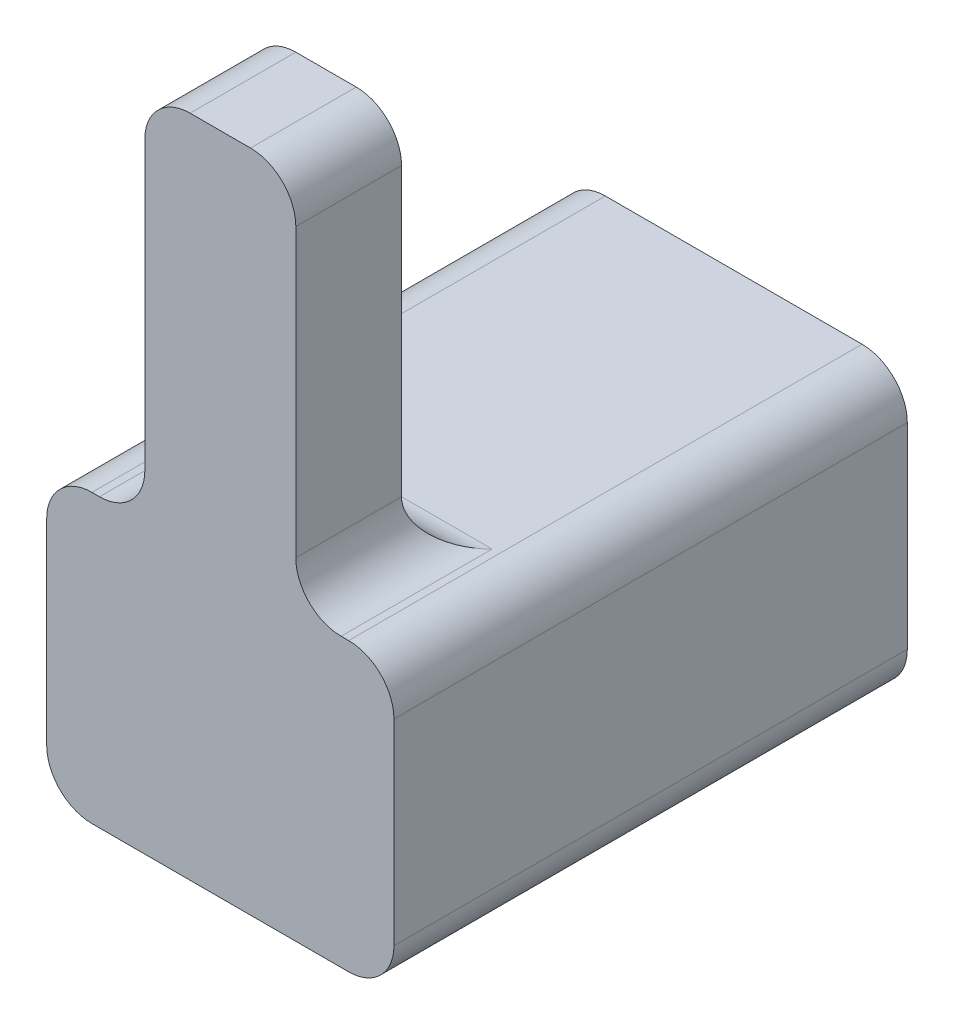
ISO-10303-21;
HEADER;
FILE_DESCRIPTION(('STEP AP214'),'2;1');
FILE_NAME('part.step','',(''),(''),'','','');
FILE_SCHEMA(('AUTOMOTIVE_DESIGN { 1 0 10303 214 1 1 1 1 }'));
ENDSEC;
DATA;
#1=APPLICATION_CONTEXT('core data for automotive mechanical design processes');
#2=APPLICATION_PROTOCOL_DEFINITION('international standard','automotive_design',2000,#1);
#3=PRODUCT_CONTEXT('',#1,'mechanical');
#4=PRODUCT('Part','Part','',(#3));
#5=PRODUCT_RELATED_PRODUCT_CATEGORY('part','',(#4));
#6=PRODUCT_DEFINITION_FORMATION('','',#4);
#7=PRODUCT_DEFINITION_CONTEXT('part definition',#1,'design');
#8=PRODUCT_DEFINITION('design','',#6,#7);
#9=PRODUCT_DEFINITION_SHAPE('','',#8);
#10=(LENGTH_UNIT() NAMED_UNIT(*) SI_UNIT(.MILLI.,.METRE.));
#11=(NAMED_UNIT(*) PLANE_ANGLE_UNIT() SI_UNIT($,.RADIAN.));
#12=(NAMED_UNIT(*) SI_UNIT($,.STERADIAN.) SOLID_ANGLE_UNIT());
#13=UNCERTAINTY_MEASURE_WITH_UNIT(LENGTH_MEASURE(1.E-05),#10,'distance_accuracy_value','');
#14=(GEOMETRIC_REPRESENTATION_CONTEXT(3) GLOBAL_UNCERTAINTY_ASSIGNED_CONTEXT((#13)) GLOBAL_UNIT_ASSIGNED_CONTEXT((#10,
#11,#12)) REPRESENTATION_CONTEXT('',''));
#15=CARTESIAN_POINT('',(0.,0.,0.));
#16=DIRECTION('',(0.,0.,1.));
#17=DIRECTION('',(1.,0.,0.));
#18=AXIS2_PLACEMENT_3D('',#15,#16,#17);
#19=CARTESIAN_POINT('',(-11.5,9.5,34.));
#20=DIRECTION('',(0.,-1.,0.));
#21=DIRECTION('',(0.,0.,-1.));
#22=AXIS2_PLACEMENT_3D('',#19,#20,#21);
#23=PLANE('',#22);
#24=DIRECTION('',(-1.,0.,0.));
#25=VECTOR('',#24,1.);
#26=CARTESIAN_POINT('',(-11.5,9.5,0.));
#27=LINE('',#26,#25);
#28=CARTESIAN_POINT('',(8.5,9.5,0.));
#29=VERTEX_POINT('',#28);
#30=CARTESIAN_POINT('',(-8.5,9.5,0.));
#31=VERTEX_POINT('',#30);
#32=EDGE_CURVE('E363',#29,#31,#27,.T.);
#33=ORIENTED_EDGE('',*,*,#32,.T.);
#34=DIRECTION('',(0.,0.,-1.));
#35=VECTOR('',#34,1.);
#36=CARTESIAN_POINT('',(-8.5,9.5,34.));
#37=LINE('',#36,#35);
#38=CARTESIAN_POINT('',(-8.5,9.5,34.));
#39=VERTEX_POINT('',#38);
#40=EDGE_CURVE('E285',#31,#39,#37,.F.);
#41=ORIENTED_EDGE('',*,*,#40,.T.);
#42=DIRECTION('',(-1.,0.,0.));
#43=VECTOR('',#42,1.);
#44=CARTESIAN_POINT('',(-11.5,9.5,34.));
#45=LINE('',#44,#43);
#46=CARTESIAN_POINT('',(-8.,9.5,34.));
#47=VERTEX_POINT('',#46);
#48=EDGE_CURVE('E353',#47,#39,#45,.T.);
#49=ORIENTED_EDGE('',*,*,#48,.F.);
#50=DIRECTION('',(0.,0.,1.));
#51=VECTOR('',#50,1.);
#52=CARTESIAN_POINT('',(-8.,9.5,27.000000000001));
#53=LINE('',#52,#51);
#54=CARTESIAN_POINT('',(-8.,9.5,24.000000000001));
#55=VERTEX_POINT('',#54);
#56=EDGE_CURVE('E283',#47,#55,#53,.F.);
#57=ORIENTED_EDGE('',*,*,#56,.T.);
#58=DIRECTION('',(-1.,0.,0.));
#59=VECTOR('',#58,1.);
#60=CARTESIAN_POINT('',(5.,9.5,24.000000000001));
#61=LINE('',#60,#59);
#62=CARTESIAN_POINT('',(8.,9.5,24.000000000001));
#63=VERTEX_POINT('',#62);
#64=EDGE_CURVE('E281',#55,#63,#61,.F.);
#65=ORIENTED_EDGE('',*,*,#64,.T.);
#66=DIRECTION('',(0.,0.,-1.));
#67=VECTOR('',#66,1.);
#68=CARTESIAN_POINT('',(8.,9.5,34.));
#69=LINE('',#68,#67);
#70=CARTESIAN_POINT('',(8.,9.5,34.));
#71=VERTEX_POINT('',#70);
#72=EDGE_CURVE('E279',#63,#71,#69,.F.);
#73=ORIENTED_EDGE('',*,*,#72,.T.);
#74=CARTESIAN_POINT('',(8.5,9.5,34.));
#75=VERTEX_POINT('',#74);
#76=EDGE_CURVE('E356',#75,#71,#45,.T.);
#77=ORIENTED_EDGE('',*,*,#76,.F.);
#78=DIRECTION('',(0.,0.,-1.));
#79=VECTOR('',#78,1.);
#80=CARTESIAN_POINT('',(8.5,9.5,34.));
#81=LINE('',#80,#79);
#82=EDGE_CURVE('E271',#75,#29,#81,.T.);
#83=ORIENTED_EDGE('',*,*,#82,.T.);
#84=EDGE_LOOP('',(#33,#41,#49,#57,#65,#73,#77,#83));
#85=FACE_BOUND('',#84,.T.);
#86=ADVANCED_FACE('F126',(#85),#23,.F.);
#87=CARTESIAN_POINT('',(11.5,-9.5,34.));
#88=DIRECTION('',(-1.,0.,0.));
#89=DIRECTION('',(0.,0.,1.));
#90=AXIS2_PLACEMENT_3D('',#87,#88,#89);
#91=PLANE('',#90);
#92=DIRECTION('',(0.,1.,0.));
#93=VECTOR('',#92,1.);
#94=CARTESIAN_POINT('',(11.5,-9.5,34.));
#95=LINE('',#94,#93);
#96=CARTESIAN_POINT('',(11.5,-6.5,34.));
#97=VERTEX_POINT('',#96);
#98=CARTESIAN_POINT('',(11.5,6.5,34.));
#99=VERTEX_POINT('',#98);
#100=EDGE_CURVE('E350',#97,#99,#95,.T.);
#101=ORIENTED_EDGE('',*,*,#100,.F.);
#102=DIRECTION('',(0.,0.,-1.));
#103=VECTOR('',#102,1.);
#104=CARTESIAN_POINT('',(11.5,-6.5,34.));
#105=LINE('',#104,#103);
#106=CARTESIAN_POINT('',(11.5,-6.5,0.));
#107=VERTEX_POINT('',#106);
#108=EDGE_CURVE('E289',#97,#107,#105,.T.);
#109=ORIENTED_EDGE('',*,*,#108,.T.);
#110=DIRECTION('',(0.,1.,0.));
#111=VECTOR('',#110,1.);
#112=CARTESIAN_POINT('',(11.5,-9.5,0.));
#113=LINE('',#112,#111);
#114=CARTESIAN_POINT('',(11.5,6.5,0.));
#115=VERTEX_POINT('',#114);
#116=EDGE_CURVE('E349',#107,#115,#113,.T.);
#117=ORIENTED_EDGE('',*,*,#116,.T.);
#118=DIRECTION('',(0.,0.,-1.));
#119=VECTOR('',#118,1.);
#120=CARTESIAN_POINT('',(11.5,6.5,34.));
#121=LINE('',#120,#119);
#122=EDGE_CURVE('E287',#115,#99,#121,.F.);
#123=ORIENTED_EDGE('',*,*,#122,.T.);
#124=EDGE_LOOP('',(#101,#109,#117,#123));
#125=FACE_BOUND('',#124,.T.);
#126=ADVANCED_FACE('F383',(#125),#91,.F.);
#127=CARTESIAN_POINT('',(-11.5,-9.5,34.));
#128=DIRECTION('',(1.,0.,0.));
#129=DIRECTION('',(0.,0.,-1.));
#130=AXIS2_PLACEMENT_3D('',#127,#128,#129);
#131=PLANE('',#130);
#132=DIRECTION('',(0.,-1.,0.));
#133=VECTOR('',#132,1.);
#134=CARTESIAN_POINT('',(-11.5,-9.5,0.));
#135=LINE('',#134,#133);
#136=CARTESIAN_POINT('',(-11.5,6.5,0.));
#137=VERTEX_POINT('',#136);
#138=CARTESIAN_POINT('',(-11.5,-6.5,0.));
#139=VERTEX_POINT('',#138);
#140=EDGE_CURVE('E366',#137,#139,#135,.T.);
#141=ORIENTED_EDGE('',*,*,#140,.T.);
#142=DIRECTION('',(0.,0.,-1.));
#143=VECTOR('',#142,1.);
#144=CARTESIAN_POINT('',(-11.5,-6.5,34.));
#145=LINE('',#144,#143);
#146=CARTESIAN_POINT('',(-11.5,-6.5,34.));
#147=VERTEX_POINT('',#146);
#148=EDGE_CURVE('E143',#139,#147,#145,.F.);
#149=ORIENTED_EDGE('',*,*,#148,.T.);
#150=DIRECTION('',(0.,-1.,0.));
#151=VECTOR('',#150,1.);
#152=CARTESIAN_POINT('',(-11.5,-9.5,34.));
#153=LINE('',#152,#151);
#154=CARTESIAN_POINT('',(-11.5,6.5,34.));
#155=VERTEX_POINT('',#154);
#156=EDGE_CURVE('E357',#155,#147,#153,.T.);
#157=ORIENTED_EDGE('',*,*,#156,.F.);
#158=DIRECTION('',(0.,0.,-1.));
#159=VECTOR('',#158,1.);
#160=CARTESIAN_POINT('',(-11.5,6.5,34.));
#161=LINE('',#160,#159);
#162=EDGE_CURVE('E316',#155,#137,#161,.T.);
#163=ORIENTED_EDGE('',*,*,#162,.T.);
#164=EDGE_LOOP('',(#141,#149,#157,#163));
#165=FACE_BOUND('',#164,.T.);
#166=ADVANCED_FACE('F421',(#165),#131,.F.);
#167=CARTESIAN_POINT('',(-11.5,-9.5,34.));
#168=DIRECTION('',(0.,1.,0.));
#169=DIRECTION('',(0.,0.,1.));
#170=AXIS2_PLACEMENT_3D('',#167,#168,#169);
#171=PLANE('',#170);
#172=DIRECTION('',(1.,0.,0.));
#173=VECTOR('',#172,1.);
#174=CARTESIAN_POINT('',(-11.5,-9.5,0.));
#175=LINE('',#174,#173);
#176=CARTESIAN_POINT('',(-8.5,-9.5,0.));
#177=VERTEX_POINT('',#176);
#178=CARTESIAN_POINT('',(8.5,-9.5,0.));
#179=VERTEX_POINT('',#178);
#180=EDGE_CURVE('E354',#177,#179,#175,.T.);
#181=ORIENTED_EDGE('',*,*,#180,.T.);
#182=DIRECTION('',(0.,0.,-1.));
#183=VECTOR('',#182,1.);
#184=CARTESIAN_POINT('',(8.5,-9.5,34.));
#185=LINE('',#184,#183);
#186=CARTESIAN_POINT('',(8.5,-9.5,34.));
#187=VERTEX_POINT('',#186);
#188=EDGE_CURVE('E303',#179,#187,#185,.F.);
#189=ORIENTED_EDGE('',*,*,#188,.T.);
#190=DIRECTION('',(1.,0.,0.));
#191=VECTOR('',#190,1.);
#192=CARTESIAN_POINT('',(-11.5,-9.5,34.));
#193=LINE('',#192,#191);
#194=CARTESIAN_POINT('',(-8.5,-9.5,34.));
#195=VERTEX_POINT('',#194);
#196=EDGE_CURVE('E273',#195,#187,#193,.T.);
#197=ORIENTED_EDGE('',*,*,#196,.F.);
#198=DIRECTION('',(0.,0.,-1.));
#199=VECTOR('',#198,1.);
#200=CARTESIAN_POINT('',(-8.5,-9.5,34.));
#201=LINE('',#200,#199);
#202=EDGE_CURVE('E300',#195,#177,#201,.T.);
#203=ORIENTED_EDGE('',*,*,#202,.T.);
#204=EDGE_LOOP('',(#181,#189,#197,#203));
#205=FACE_BOUND('',#204,.T.);
#206=ADVANCED_FACE('F371',(#205),#171,.F.);
#207=CARTESIAN_POINT('',(0.,0.,34.));
#208=DIRECTION('',(0.,0.,-1.));
#209=DIRECTION('',(-1.,0.,0.));
#210=AXIS2_PLACEMENT_3D('',#207,#208,#209);
#211=PLANE('',#210);
#212=ORIENTED_EDGE('',*,*,#196,.T.);
#213=CARTESIAN_POINT('',(8.5,-6.5,34.));
#214=DIRECTION('',(0.,0.,-1.));
#215=DIRECTION('',(-1.,0.,0.));
#216=AXIS2_PLACEMENT_3D('',#213,#214,#215);
#217=CIRCLE('',#216,3.);
#218=EDGE_CURVE('E314',#187,#97,#217,.F.);
#219=ORIENTED_EDGE('',*,*,#218,.T.);
#220=ORIENTED_EDGE('',*,*,#100,.T.);
#221=CARTESIAN_POINT('',(8.5,6.5,34.));
#222=DIRECTION('',(0.,0.,-1.));
#223=DIRECTION('',(-1.,0.,0.));
#224=AXIS2_PLACEMENT_3D('',#221,#222,#223);
#225=CIRCLE('',#224,3.);
#226=EDGE_CURVE('E305',#99,#75,#225,.F.);
#227=ORIENTED_EDGE('',*,*,#226,.T.);
#228=ORIENTED_EDGE('',*,*,#76,.T.);
#229=CARTESIAN_POINT('',(8.,12.5,34.));
#230=DIRECTION('',(0.,0.,-1.));
#231=DIRECTION('',(-1.,0.,0.));
#232=AXIS2_PLACEMENT_3D('',#229,#230,#231);
#233=CIRCLE('',#232,3.);
#234=CARTESIAN_POINT('',(5.,12.5,33.9999999999989));
#235=VERTEX_POINT('',#234);
#236=EDGE_CURVE('E12',#71,#235,#233,.T.);
#237=ORIENTED_EDGE('',*,*,#236,.T.);
#238=DIRECTION('',(0.,-1.,0.));
#239=VECTOR('',#238,1.);
#240=CARTESIAN_POINT('',(5.,34.5,33.9999999999989));
#241=LINE('',#240,#239);
#242=CARTESIAN_POINT('',(5.,31.5,33.9999999999989));
#243=VERTEX_POINT('',#242);
#244=EDGE_CURVE('E345',#243,#235,#241,.T.);
#245=ORIENTED_EDGE('',*,*,#244,.F.);
#246=CARTESIAN_POINT('',(2.,31.5,34.));
#247=DIRECTION('',(0.,0.,-1.));
#248=DIRECTION('',(-1.,0.,0.));
#249=AXIS2_PLACEMENT_3D('',#246,#247,#248);
#250=CIRCLE('',#249,3.);
#251=CARTESIAN_POINT('',(2.,34.5,33.9999999999989));
#252=VERTEX_POINT('',#251);
#253=EDGE_CURVE('E307',#243,#252,#250,.F.);
#254=ORIENTED_EDGE('',*,*,#253,.T.);
#255=DIRECTION('',(1.,0.,0.));
#256=VECTOR('',#255,1.);
#257=CARTESIAN_POINT('',(-5.,34.5,33.9999999999989));
#258=LINE('',#257,#256);
#259=CARTESIAN_POINT('',(-2.,34.5,33.9999999999989));
#260=VERTEX_POINT('',#259);
#261=EDGE_CURVE('E335',#260,#252,#258,.T.);
#262=ORIENTED_EDGE('',*,*,#261,.F.);
#263=CARTESIAN_POINT('',(-2.,31.5,34.));
#264=DIRECTION('',(0.,0.,-1.));
#265=DIRECTION('',(-1.,0.,0.));
#266=AXIS2_PLACEMENT_3D('',#263,#264,#265);
#267=CIRCLE('',#266,3.);
#268=CARTESIAN_POINT('',(-5.,31.5,33.9999999999989));
#269=VERTEX_POINT('',#268);
#270=EDGE_CURVE('E309',#260,#269,#267,.F.);
#271=ORIENTED_EDGE('',*,*,#270,.T.);
#272=DIRECTION('',(0.,-1.,0.));
#273=VECTOR('',#272,1.);
#274=CARTESIAN_POINT('',(-5.,34.5,33.9999999999989));
#275=LINE('',#274,#273);
#276=CARTESIAN_POINT('',(-5.,12.5,33.9999999999989));
#277=VERTEX_POINT('',#276);
#278=EDGE_CURVE('E248',#269,#277,#275,.T.);
#279=ORIENTED_EDGE('',*,*,#278,.T.);
#280=CARTESIAN_POINT('',(-8.,12.5,34.));
#281=DIRECTION('',(0.,0.,-1.));
#282=DIRECTION('',(-1.,0.,0.));
#283=AXIS2_PLACEMENT_3D('',#280,#281,#282);
#284=CIRCLE('',#283,3.);
#285=EDGE_CURVE('E135',#277,#47,#284,.T.);
#286=ORIENTED_EDGE('',*,*,#285,.T.);
#287=ORIENTED_EDGE('',*,*,#48,.T.);
#288=CARTESIAN_POINT('',(-8.5,6.5,34.));
#289=DIRECTION('',(0.,0.,-1.));
#290=DIRECTION('',(-1.,0.,0.));
#291=AXIS2_PLACEMENT_3D('',#288,#289,#290);
#292=CIRCLE('',#291,3.);
#293=EDGE_CURVE('E150',#39,#155,#292,.F.);
#294=ORIENTED_EDGE('',*,*,#293,.T.);
#295=ORIENTED_EDGE('',*,*,#156,.T.);
#296=CARTESIAN_POINT('',(-8.5,-6.5,34.));
#297=DIRECTION('',(0.,0.,-1.));
#298=DIRECTION('',(-1.,0.,0.));
#299=AXIS2_PLACEMENT_3D('',#296,#297,#298);
#300=CIRCLE('',#299,3.);
#301=EDGE_CURVE('E312',#147,#195,#300,.F.);
#302=ORIENTED_EDGE('',*,*,#301,.T.);
#303=EDGE_LOOP('',(#212,#219,#220,#227,#228,#237,#245,#254,#262,#271,#279,#286,#287,#294,#295,#302));
#304=FACE_BOUND('',#303,.T.);
#305=ADVANCED_FACE('F380',(#304),#211,.F.);
#306=CARTESIAN_POINT('',(0.,0.,0.));
#307=DIRECTION('',(0.,0.,-1.));
#308=DIRECTION('',(-1.,0.,0.));
#309=AXIS2_PLACEMENT_3D('',#306,#307,#308);
#310=PLANE('',#309);
#311=ORIENTED_EDGE('',*,*,#116,.F.);
#312=CARTESIAN_POINT('',(8.5,-6.5,0.));
#313=DIRECTION('',(0.,0.,-1.));
#314=DIRECTION('',(-1.,0.,0.));
#315=AXIS2_PLACEMENT_3D('',#312,#313,#314);
#316=CIRCLE('',#315,3.);
#317=EDGE_CURVE('E298',#107,#179,#316,.T.);
#318=ORIENTED_EDGE('',*,*,#317,.T.);
#319=ORIENTED_EDGE('',*,*,#180,.F.);
#320=CARTESIAN_POINT('',(-8.5,-6.5,0.));
#321=DIRECTION('',(0.,0.,-1.));
#322=DIRECTION('',(-1.,0.,0.));
#323=AXIS2_PLACEMENT_3D('',#320,#321,#322);
#324=CIRCLE('',#323,3.);
#325=EDGE_CURVE('E296',#177,#139,#324,.T.);
#326=ORIENTED_EDGE('',*,*,#325,.T.);
#327=ORIENTED_EDGE('',*,*,#140,.F.);
#328=CARTESIAN_POINT('',(-8.5,6.5,0.));
#329=DIRECTION('',(0.,0.,-1.));
#330=DIRECTION('',(-1.,0.,0.));
#331=AXIS2_PLACEMENT_3D('',#328,#329,#330);
#332=CIRCLE('',#331,3.);
#333=EDGE_CURVE('E294',#137,#31,#332,.T.);
#334=ORIENTED_EDGE('',*,*,#333,.T.);
#335=ORIENTED_EDGE('',*,*,#32,.F.);
#336=CARTESIAN_POINT('',(8.5,6.5,0.));
#337=DIRECTION('',(0.,0.,-1.));
#338=DIRECTION('',(-1.,0.,0.));
#339=AXIS2_PLACEMENT_3D('',#336,#337,#338);
#340=CIRCLE('',#339,3.);
#341=EDGE_CURVE('E292',#29,#115,#340,.T.);
#342=ORIENTED_EDGE('',*,*,#341,.T.);
#343=EDGE_LOOP('',(#311,#318,#319,#326,#327,#334,#335,#342));
#344=FACE_BOUND('',#343,.T.);
#345=ADVANCED_FACE('F523',(#344),#310,.T.);
#346=CARTESIAN_POINT('',(-5.,34.5,33.9999999999989));
#347=DIRECTION('',(1.,0.,0.));
#348=DIRECTION('',(0.,0.,-1.));
#349=AXIS2_PLACEMENT_3D('',#346,#347,#348);
#350=PLANE('',#349);
#351=DIRECTION('',(0.,-1.,0.));
#352=VECTOR('',#351,1.);
#353=CARTESIAN_POINT('',(-5.,34.5,27.000000000001));
#354=LINE('',#353,#352);
#355=CARTESIAN_POINT('',(-5.,31.5,27.000000000001));
#356=VERTEX_POINT('',#355);
#357=CARTESIAN_POINT('',(-5.,12.5,27.000000000001));
#358=VERTEX_POINT('',#357);
#359=EDGE_CURVE('E246',#356,#358,#354,.T.);
#360=ORIENTED_EDGE('',*,*,#359,.T.);
#361=DIRECTION('',(0.,0.,1.));
#362=VECTOR('',#361,1.);
#363=CARTESIAN_POINT('',(-5.,12.5,34.));
#364=LINE('',#363,#362);
#365=EDGE_CURVE('E251',#358,#277,#364,.T.);
#366=ORIENTED_EDGE('',*,*,#365,.T.);
#367=ORIENTED_EDGE('',*,*,#278,.F.);
#368=DIRECTION('',(0.,0.,1.));
#369=VECTOR('',#368,1.);
#370=CARTESIAN_POINT('',(-5.,31.5,33.9999999999989));
#371=LINE('',#370,#369);
#372=EDGE_CURVE('E243',#269,#356,#371,.F.);
#373=ORIENTED_EDGE('',*,*,#372,.T.);
#374=EDGE_LOOP('',(#360,#366,#367,#373));
#375=FACE_BOUND('',#374,.T.);
#376=ADVANCED_FACE('F245',(#375),#350,.F.);
#377=CARTESIAN_POINT('',(5.,34.5,33.9999999999989));
#378=DIRECTION('',(-1.,0.,0.));
#379=DIRECTION('',(0.,0.,1.));
#380=AXIS2_PLACEMENT_3D('',#377,#378,#379);
#381=PLANE('',#380);
#382=DIRECTION('',(0.,-1.,0.));
#383=VECTOR('',#382,1.);
#384=CARTESIAN_POINT('',(5.,34.5,27.000000000001));
#385=LINE('',#384,#383);
#386=CARTESIAN_POINT('',(5.,31.5,27.000000000001));
#387=VERTEX_POINT('',#386);
#388=CARTESIAN_POINT('',(5.,12.5,27.000000000001));
#389=VERTEX_POINT('',#388);
#390=EDGE_CURVE('E262',#387,#389,#385,.T.);
#391=ORIENTED_EDGE('',*,*,#390,.F.);
#392=DIRECTION('',(0.,0.,-1.));
#393=VECTOR('',#392,1.);
#394=CARTESIAN_POINT('',(5.,31.5,33.9999999999989));
#395=LINE('',#394,#393);
#396=EDGE_CURVE('E327',#387,#243,#395,.F.);
#397=ORIENTED_EDGE('',*,*,#396,.T.);
#398=ORIENTED_EDGE('',*,*,#244,.T.);
#399=DIRECTION('',(0.,0.,-1.));
#400=VECTOR('',#399,1.);
#401=CARTESIAN_POINT('',(5.,12.5,27.000000000001));
#402=LINE('',#401,#400);
#403=EDGE_CURVE('E325',#235,#389,#402,.T.);
#404=ORIENTED_EDGE('',*,*,#403,.T.);
#405=EDGE_LOOP('',(#391,#397,#398,#404));
#406=FACE_BOUND('',#405,.T.);
#407=ADVANCED_FACE('F401',(#406),#381,.F.);
#408=CARTESIAN_POINT('',(-5.,34.5,27.000000000001));
#409=DIRECTION('',(0.,0.,1.));
#410=DIRECTION('',(1.,0.,0.));
#411=AXIS2_PLACEMENT_3D('',#408,#409,#410);
#412=PLANE('',#411);
#413=ORIENTED_EDGE('',*,*,#390,.T.);
#414=DIRECTION('',(-1.,0.,0.));
#415=VECTOR('',#414,1.);
#416=CARTESIAN_POINT('',(-5.,12.5,27.000000000001));
#417=LINE('',#416,#415);
#418=EDGE_CURVE('E261',#389,#358,#417,.T.);
#419=ORIENTED_EDGE('',*,*,#418,.T.);
#420=ORIENTED_EDGE('',*,*,#359,.F.);
#421=CARTESIAN_POINT('',(-2.,31.5,27.000000000001));
#422=DIRECTION('',(0.,0.,1.));
#423=DIRECTION('',(1.,0.,0.));
#424=AXIS2_PLACEMENT_3D('',#421,#422,#423);
#425=CIRCLE('',#424,3.);
#426=CARTESIAN_POINT('',(-2.,34.5,27.000000000001));
#427=VERTEX_POINT('',#426);
#428=EDGE_CURVE('E258',#356,#427,#425,.F.);
#429=ORIENTED_EDGE('',*,*,#428,.T.);
#430=DIRECTION('',(-1.,0.,0.));
#431=VECTOR('',#430,1.);
#432=CARTESIAN_POINT('',(-5.,34.5,27.000000000001));
#433=LINE('',#432,#431);
#434=CARTESIAN_POINT('',(2.,34.5,27.000000000001));
#435=VERTEX_POINT('',#434);
#436=EDGE_CURVE('E263',#435,#427,#433,.T.);
#437=ORIENTED_EDGE('',*,*,#436,.F.);
#438=CARTESIAN_POINT('',(2.,31.5,27.000000000001));
#439=DIRECTION('',(0.,0.,1.));
#440=DIRECTION('',(1.,0.,0.));
#441=AXIS2_PLACEMENT_3D('',#438,#439,#440);
#442=CIRCLE('',#441,3.);
#443=EDGE_CURVE('E269',#435,#387,#442,.F.);
#444=ORIENTED_EDGE('',*,*,#443,.T.);
#445=EDGE_LOOP('',(#413,#419,#420,#429,#437,#444));
#446=FACE_BOUND('',#445,.T.);
#447=ADVANCED_FACE('F256',(#446),#412,.F.);
#448=CARTESIAN_POINT('',(0.,34.5,0.));
#449=DIRECTION('',(0.,-1.,0.));
#450=DIRECTION('',(0.,0.,-1.));
#451=AXIS2_PLACEMENT_3D('',#448,#449,#450);
#452=PLANE('',#451);
#453=ORIENTED_EDGE('',*,*,#436,.T.);
#454=DIRECTION('',(0.,0.,1.));
#455=VECTOR('',#454,1.);
#456=CARTESIAN_POINT('',(-2.,34.5,0.));
#457=LINE('',#456,#455);
#458=EDGE_CURVE('E268',#427,#260,#457,.T.);
#459=ORIENTED_EDGE('',*,*,#458,.T.);
#460=ORIENTED_EDGE('',*,*,#261,.T.);
#461=DIRECTION('',(0.,0.,-1.));
#462=VECTOR('',#461,1.);
#463=CARTESIAN_POINT('',(2.,34.5,0.));
#464=LINE('',#463,#462);
#465=EDGE_CURVE('E321',#252,#435,#464,.T.);
#466=ORIENTED_EDGE('',*,*,#465,.T.);
#467=EDGE_LOOP('',(#453,#459,#460,#466));
#468=FACE_BOUND('',#467,.T.);
#469=ADVANCED_FACE('F406',(#468),#452,.F.);
#470=CARTESIAN_POINT('',(8.,12.5,33.9999999999989));
#471=DIRECTION('',(0.,0.,1.));
#472=DIRECTION('',(1.,0.,0.));
#473=AXIS2_PLACEMENT_3D('',#470,#471,#472);
#474=CYLINDRICAL_SURFACE('',#473,3.);
#475=ORIENTED_EDGE('',*,*,#236,.F.);
#476=ORIENTED_EDGE('',*,*,#72,.F.);
#477=CARTESIAN_POINT('',(8.,12.5,24.000000000001));
#478=DIRECTION('',(0.707106781186547,0.,0.707106781186547));
#479=DIRECTION('',(-0.707106781186547,0.,0.707106781186547));
#480=AXIS2_PLACEMENT_3D('',#477,#478,#479);
#481=ELLIPSE('',#480,4.24264068711928,3.);
#482=EDGE_CURVE('E130',#389,#63,#481,.T.);
#483=ORIENTED_EDGE('',*,*,#482,.F.);
#484=ORIENTED_EDGE('',*,*,#403,.F.);
#485=EDGE_LOOP('',(#475,#476,#483,#484));
#486=FACE_BOUND('',#485,.T.);
#487=ADVANCED_FACE('F395',(#486),#474,.F.);
#488=CARTESIAN_POINT('',(-8.,12.5,33.9999999999989));
#489=DIRECTION('',(0.,0.,-1.));
#490=DIRECTION('',(-1.,0.,0.));
#491=AXIS2_PLACEMENT_3D('',#488,#489,#490);
#492=CYLINDRICAL_SURFACE('',#491,3.);
#493=ORIENTED_EDGE('',*,*,#285,.F.);
#494=ORIENTED_EDGE('',*,*,#365,.F.);
#495=CARTESIAN_POINT('',(-8.,12.5,24.000000000001));
#496=DIRECTION('',(0.707106781186547,0.,-0.707106781186548));
#497=DIRECTION('',(-0.707106781186548,0.,-0.707106781186547));
#498=AXIS2_PLACEMENT_3D('',#495,#496,#497);
#499=ELLIPSE('',#498,4.24264068711929,3.);
#500=EDGE_CURVE('E329',#55,#358,#499,.F.);
#501=ORIENTED_EDGE('',*,*,#500,.F.);
#502=ORIENTED_EDGE('',*,*,#56,.F.);
#503=EDGE_LOOP('',(#493,#494,#501,#502));
#504=FACE_BOUND('',#503,.T.);
#505=ADVANCED_FACE('F413',(#504),#492,.F.);
#506=CARTESIAN_POINT('',(-5.,12.5,24.000000000001));
#507=DIRECTION('',(1.,0.,0.));
#508=DIRECTION('',(0.,0.,-1.));
#509=AXIS2_PLACEMENT_3D('',#506,#507,#508);
#510=CYLINDRICAL_SURFACE('',#509,3.);
#511=ORIENTED_EDGE('',*,*,#482,.T.);
#512=ORIENTED_EDGE('',*,*,#64,.F.);
#513=ORIENTED_EDGE('',*,*,#500,.T.);
#514=ORIENTED_EDGE('',*,*,#418,.F.);
#515=EDGE_LOOP('',(#511,#512,#513,#514));
#516=FACE_BOUND('',#515,.T.);
#517=ADVANCED_FACE('F426',(#516),#510,.F.);
#518=CARTESIAN_POINT('',(8.5,-6.5,34.));
#519=DIRECTION('',(0.,0.,-1.));
#520=DIRECTION('',(-1.,0.,0.));
#521=AXIS2_PLACEMENT_3D('',#518,#519,#520);
#522=CYLINDRICAL_SURFACE('',#521,3.);
#523=ORIENTED_EDGE('',*,*,#218,.F.);
#524=ORIENTED_EDGE('',*,*,#188,.F.);
#525=ORIENTED_EDGE('',*,*,#317,.F.);
#526=ORIENTED_EDGE('',*,*,#108,.F.);
#527=EDGE_LOOP('',(#523,#524,#525,#526));
#528=FACE_BOUND('',#527,.T.);
#529=ADVANCED_FACE('F377',(#528),#522,.T.);
#530=CARTESIAN_POINT('',(-8.5,-6.5,34.));
#531=DIRECTION('',(0.,0.,-1.));
#532=DIRECTION('',(-1.,0.,0.));
#533=AXIS2_PLACEMENT_3D('',#530,#531,#532);
#534=CYLINDRICAL_SURFACE('',#533,3.);
#535=ORIENTED_EDGE('',*,*,#301,.F.);
#536=ORIENTED_EDGE('',*,*,#148,.F.);
#537=ORIENTED_EDGE('',*,*,#325,.F.);
#538=ORIENTED_EDGE('',*,*,#202,.F.);
#539=EDGE_LOOP('',(#535,#536,#537,#538));
#540=FACE_BOUND('',#539,.T.);
#541=ADVANCED_FACE('F434',(#540),#534,.T.);
#542=CARTESIAN_POINT('',(-8.5,6.5,34.));
#543=DIRECTION('',(0.,0.,-1.));
#544=DIRECTION('',(-1.,0.,0.));
#545=AXIS2_PLACEMENT_3D('',#542,#543,#544);
#546=CYLINDRICAL_SURFACE('',#545,3.);
#547=ORIENTED_EDGE('',*,*,#293,.F.);
#548=ORIENTED_EDGE('',*,*,#40,.F.);
#549=ORIENTED_EDGE('',*,*,#333,.F.);
#550=ORIENTED_EDGE('',*,*,#162,.F.);
#551=EDGE_LOOP('',(#547,#548,#549,#550));
#552=FACE_BOUND('',#551,.T.);
#553=ADVANCED_FACE('F437',(#552),#546,.T.);
#554=CARTESIAN_POINT('',(-2.,31.5,0.));
#555=DIRECTION('',(0.,0.,1.));
#556=DIRECTION('',(1.,0.,0.));
#557=AXIS2_PLACEMENT_3D('',#554,#555,#556);
#558=CYLINDRICAL_SURFACE('',#557,3.);
#559=ORIENTED_EDGE('',*,*,#428,.F.);
#560=ORIENTED_EDGE('',*,*,#372,.F.);
#561=ORIENTED_EDGE('',*,*,#270,.F.);
#562=ORIENTED_EDGE('',*,*,#458,.F.);
#563=EDGE_LOOP('',(#559,#560,#561,#562));
#564=FACE_BOUND('',#563,.T.);
#565=ADVANCED_FACE('F266',(#564),#558,.T.);
#566=CARTESIAN_POINT('',(2.,31.5,0.));
#567=DIRECTION('',(0.,0.,-1.));
#568=DIRECTION('',(-1.,0.,0.));
#569=AXIS2_PLACEMENT_3D('',#566,#567,#568);
#570=CYLINDRICAL_SURFACE('',#569,3.);
#571=ORIENTED_EDGE('',*,*,#253,.F.);
#572=ORIENTED_EDGE('',*,*,#396,.F.);
#573=ORIENTED_EDGE('',*,*,#443,.F.);
#574=ORIENTED_EDGE('',*,*,#465,.F.);
#575=EDGE_LOOP('',(#571,#572,#573,#574));
#576=FACE_BOUND('',#575,.T.);
#577=ADVANCED_FACE('F404',(#576),#570,.T.);
#578=CARTESIAN_POINT('',(8.5,6.5,34.));
#579=DIRECTION('',(0.,0.,-1.));
#580=DIRECTION('',(-1.,0.,0.));
#581=AXIS2_PLACEMENT_3D('',#578,#579,#580);
#582=CYLINDRICAL_SURFACE('',#581,3.);
#583=ORIENTED_EDGE('',*,*,#226,.F.);
#584=ORIENTED_EDGE('',*,*,#122,.F.);
#585=ORIENTED_EDGE('',*,*,#341,.F.);
#586=ORIENTED_EDGE('',*,*,#82,.F.);
#587=EDGE_LOOP('',(#583,#584,#585,#586));
#588=FACE_BOUND('',#587,.T.);
#589=ADVANCED_FACE('F128',(#588),#582,.T.);
#590=CLOSED_SHELL('',(#86,#126,#166,#206,#305,#345,#376,#407,#447,#469,#487,#505,#517,#529,#541,
#553,#565,#577,#589));
#591=MANIFOLD_SOLID_BREP('B2',#590);
#592=ADVANCED_BREP_SHAPE_REPRESENTATION('',(#18,#591),#14);
#593=SHAPE_DEFINITION_REPRESENTATION(#9,#592);
ENDSEC;
END-ISO-10303-21;
